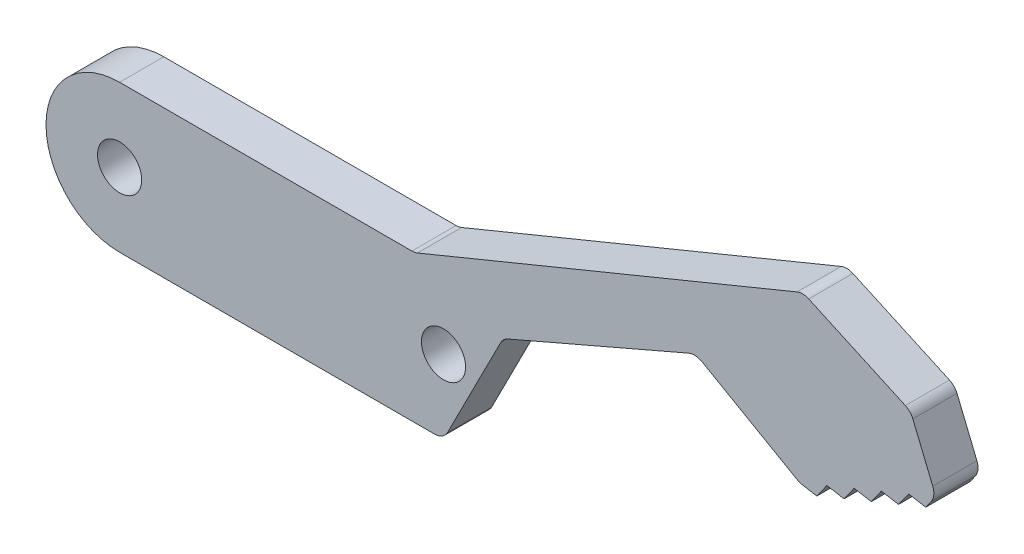
ISO-10303-21;
HEADER;
FILE_DESCRIPTION(('STEP AP214'),'2;1');
FILE_NAME('part.step','',(''),(''),'','','');
FILE_SCHEMA(('AUTOMOTIVE_DESIGN { 1 0 10303 214 1 1 1 1 }'));
ENDSEC;
DATA;
#1=APPLICATION_CONTEXT('core data for automotive mechanical design processes');
#2=APPLICATION_PROTOCOL_DEFINITION('international standard','automotive_design',2000,#1);
#3=PRODUCT_CONTEXT('',#1,'mechanical');
#4=PRODUCT('Part','Part','',(#3));
#5=PRODUCT_RELATED_PRODUCT_CATEGORY('part','',(#4));
#6=PRODUCT_DEFINITION_FORMATION('','',#4);
#7=PRODUCT_DEFINITION_CONTEXT('part definition',#1,'design');
#8=PRODUCT_DEFINITION('design','',#6,#7);
#9=PRODUCT_DEFINITION_SHAPE('','',#8);
#10=(LENGTH_UNIT() NAMED_UNIT(*) SI_UNIT(.MILLI.,.METRE.));
#11=(NAMED_UNIT(*) PLANE_ANGLE_UNIT() SI_UNIT($,.RADIAN.));
#12=(NAMED_UNIT(*) SI_UNIT($,.STERADIAN.) SOLID_ANGLE_UNIT());
#13=UNCERTAINTY_MEASURE_WITH_UNIT(LENGTH_MEASURE(1.E-05),#10,'distance_accuracy_value','');
#14=(GEOMETRIC_REPRESENTATION_CONTEXT(3) GLOBAL_UNCERTAINTY_ASSIGNED_CONTEXT((#13)) GLOBAL_UNIT_ASSIGNED_CONTEXT((#10,
#11,#12)) REPRESENTATION_CONTEXT('',''));
#15=CARTESIAN_POINT('',(0.,0.,0.));
#16=DIRECTION('',(0.,0.,1.));
#17=DIRECTION('',(1.,0.,0.));
#18=AXIS2_PLACEMENT_3D('',#15,#16,#17);
#19=CARTESIAN_POINT('',(19.4962894595564,-9.92044913865942,3.));
#20=DIRECTION('',(0.891254300812614,-0.453503882324086,0.));
#21=DIRECTION('',(0.453503882324086,0.891254300812614,0.));
#22=AXIS2_PLACEMENT_3D('',#19,#20,#21);
#23=PLANE('',#22);
#24=DIRECTION('',(-0.453503882324086,-0.891254300812614,0.));
#25=VECTOR('',#24,1.);
#26=CARTESIAN_POINT('',(19.4962894595564,-9.92044913865942,0.));
#27=LINE('',#26,#25);
#28=CARTESIAN_POINT('',(25.8783067701919,2.62189194740786,0.));
#29=VERTEX_POINT('',#28);
#30=CARTESIAN_POINT('',(22.278077885083,-4.45350388232409,0.));
#31=VERTEX_POINT('',#30);
#32=EDGE_CURVE('E326',#29,#31,#27,.T.);
#33=ORIENTED_EDGE('',*,*,#32,.F.);
#34=DIRECTION('',(0.,0.,-1.));
#35=VECTOR('',#34,1.);
#36=CARTESIAN_POINT('',(25.8783067701919,2.62189194740786,3.));
#37=LINE('',#36,#35);
#38=CARTESIAN_POINT('',(25.8783067701919,2.62189194740786,3.));
#39=VERTEX_POINT('',#38);
#40=EDGE_CURVE('E312',#29,#39,#37,.F.);
#41=ORIENTED_EDGE('',*,*,#40,.T.);
#42=DIRECTION('',(-0.453503882324086,-0.891254300812614,0.));
#43=VECTOR('',#42,1.);
#44=CARTESIAN_POINT('',(19.4962894595564,-9.92044913865942,3.));
#45=LINE('',#44,#43);
#46=CARTESIAN_POINT('',(22.278077885083,-4.45350388232409,3.));
#47=VERTEX_POINT('',#46);
#48=EDGE_CURVE('E344',#39,#47,#45,.T.);
#49=ORIENTED_EDGE('',*,*,#48,.T.);
#50=DIRECTION('',(0.,0.,-1.));
#51=VECTOR('',#50,1.);
#52=CARTESIAN_POINT('',(22.278077885083,-4.45350388232409,0.));
#53=LINE('',#52,#51);
#54=EDGE_CURVE('E309',#47,#31,#53,.T.);
#55=ORIENTED_EDGE('',*,*,#54,.T.);
#56=EDGE_LOOP('',(#33,#41,#49,#55));
#57=FACE_BOUND('',#56,.T.);
#58=ADVANCED_FACE('F45',(#57),#23,.T.);
#59=CARTESIAN_POINT('',(3.02444816193977,-7.00068530324171,3.));
#60=DIRECTION('',(0.396593498418017,-0.917994333867349,0.));
#61=DIRECTION('',(0.917994333867349,0.396593498418017,0.));
#62=AXIS2_PLACEMENT_3D('',#59,#60,#61);
#63=PLANE('',#62);
#64=DIRECTION('',(-0.917994333867349,-0.396593498418017,0.));
#65=VECTOR('',#64,1.);
#66=CARTESIAN_POINT('',(3.02444816193977,-7.00068530324171,0.));
#67=LINE('',#66,#65);
#68=CARTESIAN_POINT('',(38.6548047170005,8.39240290518155,0.));
#69=VERTEX_POINT('',#68);
#70=CARTESIAN_POINT('',(26.3729675725865,3.08638239895113,0.));
#71=VERTEX_POINT('',#70);
#72=EDGE_CURVE('E328',#69,#71,#67,.T.);
#73=ORIENTED_EDGE('',*,*,#72,.F.);
#74=DIRECTION('',(0.,0.,-1.));
#75=VECTOR('',#74,1.);
#76=CARTESIAN_POINT('',(38.6548047170005,8.39240290518155,3.));
#77=LINE('',#76,#75);
#78=CARTESIAN_POINT('',(38.6548047170005,8.39240290518155,3.));
#79=VERTEX_POINT('',#78);
#80=EDGE_CURVE('E307',#69,#79,#77,.F.);
#81=ORIENTED_EDGE('',*,*,#80,.T.);
#82=DIRECTION('',(-0.917994333867349,-0.396593498418017,0.));
#83=VECTOR('',#82,1.);
#84=CARTESIAN_POINT('',(3.02444816193977,-7.00068530324171,3.));
#85=LINE('',#84,#83);
#86=CARTESIAN_POINT('',(26.3729675725865,3.08638239895113,3.));
#87=VERTEX_POINT('',#86);
#88=EDGE_CURVE('E342',#79,#87,#85,.T.);
#89=ORIENTED_EDGE('',*,*,#88,.T.);
#90=DIRECTION('',(0.,0.,-1.));
#91=VECTOR('',#90,1.);
#92=CARTESIAN_POINT('',(26.3729675725865,3.08638239895112,0.));
#93=LINE('',#92,#91);
#94=EDGE_CURVE('E304',#87,#71,#93,.T.);
#95=ORIENTED_EDGE('',*,*,#94,.T.);
#96=EDGE_LOOP('',(#73,#81,#89,#95));
#97=FACE_BOUND('',#96,.T.);
#98=ADVANCED_FACE('F346',(#97),#63,.T.);
#99=CARTESIAN_POINT('',(13.3625167381365,23.3363393857757,3.));
#100=DIRECTION('',(-0.496908690756811,-0.867802830745759,0.));
#101=DIRECTION('',(0.867802830745759,-0.496908690756811,0.));
#102=AXIS2_PLACEMENT_3D('',#99,#100,#101);
#103=PLANE('',#102);
#104=DIRECTION('',(-0.867802830745759,0.496908690756811,0.));
#105=VECTOR('',#104,1.);
#106=CARTESIAN_POINT('',(13.3625167381365,23.3363393857757,0.));
#107=LINE('',#106,#105);
#108=CARTESIAN_POINT('',(46.0359803236668,4.6273337942362,0.));
#109=VERTEX_POINT('',#108);
#110=CARTESIAN_POINT('',(39.5483069061753,8.34221140205995,0.));
#111=VERTEX_POINT('',#110);
#112=EDGE_CURVE('E400',#109,#111,#107,.T.);
#113=ORIENTED_EDGE('',*,*,#112,.F.);
#114=DIRECTION('',(0.,0.,-1.));
#115=VECTOR('',#114,1.);
#116=CARTESIAN_POINT('',(46.0359803236668,4.6273337942362,3.));
#117=LINE('',#116,#115);
#118=CARTESIAN_POINT('',(46.0359803236668,4.6273337942362,3.));
#119=VERTEX_POINT('',#118);
#120=EDGE_CURVE('E273',#109,#119,#117,.F.);
#121=ORIENTED_EDGE('',*,*,#120,.T.);
#122=DIRECTION('',(-0.867802830745759,0.496908690756811,0.));
#123=VECTOR('',#122,1.);
#124=CARTESIAN_POINT('',(13.3625167381365,23.3363393857757,3.));
#125=LINE('',#124,#123);
#126=CARTESIAN_POINT('',(39.5483069061753,8.34221140205995,3.));
#127=VERTEX_POINT('',#126);
#128=EDGE_CURVE('E238',#119,#127,#125,.T.);
#129=ORIENTED_EDGE('',*,*,#128,.T.);
#130=DIRECTION('',(0.,0.,-1.));
#131=VECTOR('',#130,1.);
#132=CARTESIAN_POINT('',(39.5483069061753,8.34221140205995,0.));
#133=LINE('',#132,#131);
#134=EDGE_CURVE('E270',#127,#111,#133,.T.);
#135=ORIENTED_EDGE('',*,*,#134,.T.);
#136=EDGE_LOOP('',(#113,#121,#129,#135));
#137=FACE_BOUND('',#136,.T.);
#138=ADVANCED_FACE('F553',(#137),#103,.T.);
#139=CARTESIAN_POINT('',(2.12068725055269,12.200106201943,3.));
#140=DIRECTION('',(0.171257275030371,0.985226342395072,0.));
#141=DIRECTION('',(-0.985226342395072,0.171257275030371,0.));
#142=AXIS2_PLACEMENT_3D('',#139,#140,#141);
#143=PLANE('',#142);
#144=DIRECTION('',(0.985226342395072,-0.171257275030371,0.));
#145=VECTOR('',#144,1.);
#146=CARTESIAN_POINT('',(2.12068725055269,12.200106201943,3.));
#147=LINE('',#146,#145);
#148=CARTESIAN_POINT('',(46.3616317393933,4.50991028258688,3.));
#149=VERTEX_POINT('',#148);
#150=CARTESIAN_POINT('',(47.3529322035688,4.33759717145107,3.));
#151=VERTEX_POINT('',#150);
#152=EDGE_CURVE('E225',#149,#151,#147,.T.);
#153=ORIENTED_EDGE('',*,*,#152,.F.);
#154=DIRECTION('',(0.,0.,-1.));
#155=VECTOR('',#154,1.);
#156=CARTESIAN_POINT('',(46.3616317393933,4.50991028258688,0.));
#157=LINE('',#156,#155);
#158=CARTESIAN_POINT('',(46.3616317393933,4.50991028258688,0.));
#159=VERTEX_POINT('',#158);
#160=EDGE_CURVE('E253',#149,#159,#157,.T.);
#161=ORIENTED_EDGE('',*,*,#160,.T.);
#162=DIRECTION('',(0.985226342395072,-0.171257275030371,0.));
#163=VECTOR('',#162,1.);
#164=CARTESIAN_POINT('',(2.12068725055269,12.200106201943,0.));
#165=LINE('',#164,#163);
#166=CARTESIAN_POINT('',(47.3529322035688,4.33759717145107,0.));
#167=VERTEX_POINT('',#166);
#168=EDGE_CURVE('E251',#159,#167,#165,.T.);
#169=ORIENTED_EDGE('',*,*,#168,.T.);
#170=DIRECTION('',(0.,0.,-1.));
#171=VECTOR('',#170,1.);
#172=CARTESIAN_POINT('',(47.3529322035688,4.33759717145107,3.));
#173=LINE('',#172,#171);
#174=EDGE_CURVE('E244',#151,#167,#173,.T.);
#175=ORIENTED_EDGE('',*,*,#174,.F.);
#176=EDGE_LOOP('',(#153,#161,#169,#175));
#177=FACE_BOUND('',#176,.T.);
#178=ADVANCED_FACE('F249',(#177),#143,.F.);
#179=CARTESIAN_POINT('',(29.3832302084348,-20.911746854221,3.));
#180=DIRECTION('',(-0.814732571298571,0.579836905746106,0.));
#181=DIRECTION('',(-0.579836905746106,-0.814732571298571,0.));
#182=AXIS2_PLACEMENT_3D('',#179,#180,#181);
#183=PLANE('',#182);
#184=DIRECTION('',(0.579836905746106,0.814732571298571,0.));
#185=VECTOR('',#184,1.);
#186=CARTESIAN_POINT('',(29.3832302084348,-20.911746854221,0.));
#187=LINE('',#186,#185);
#188=CARTESIAN_POINT('',(48.0382444817135,5.30053386792921,0.));
#189=VERTEX_POINT('',#188);
#190=EDGE_CURVE('E404',#167,#189,#187,.T.);
#191=ORIENTED_EDGE('',*,*,#190,.T.);
#192=DIRECTION('',(0.,0.,-1.));
#193=VECTOR('',#192,1.);
#194=CARTESIAN_POINT('',(48.0382444817135,5.30053386792921,3.));
#195=LINE('',#194,#193);
#196=CARTESIAN_POINT('',(48.0382444817135,5.30053386792921,3.));
#197=VERTEX_POINT('',#196);
#198=EDGE_CURVE('E246',#197,#189,#195,.T.);
#199=ORIENTED_EDGE('',*,*,#198,.F.);
#200=DIRECTION('',(0.579836905746106,0.814732571298571,0.));
#201=VECTOR('',#200,1.);
#202=CARTESIAN_POINT('',(29.3832302084348,-20.911746854221,3.));
#203=LINE('',#202,#201);
#204=EDGE_CURVE('E230',#151,#197,#203,.T.);
#205=ORIENTED_EDGE('',*,*,#204,.F.);
#206=ORIENTED_EDGE('',*,*,#174,.T.);
#207=EDGE_LOOP('',(#191,#199,#205,#206));
#208=FACE_BOUND('',#207,.T.);
#209=ADVANCED_FACE('F243',(#208),#183,.F.);
#210=CARTESIAN_POINT('',(2.30326040358783,13.2504316830208,3.));
#211=DIRECTION('',(0.171257275030372,0.985226342395072,0.));
#212=DIRECTION('',(-0.985226342395072,0.171257275030372,0.));
#213=AXIS2_PLACEMENT_3D('',#210,#211,#212);
#214=PLANE('',#213);
#215=DIRECTION('',(0.985226342395072,-0.171257275030372,0.));
#216=VECTOR('',#215,1.);
#217=CARTESIAN_POINT('',(2.30326040358783,13.2504316830208,0.));
#218=LINE('',#217,#216);
#219=CARTESIAN_POINT('',(49.2026886599019,5.09812399691748,0.));
#220=VERTEX_POINT('',#219);
#221=EDGE_CURVE('E406',#189,#220,#218,.T.);
#222=ORIENTED_EDGE('',*,*,#221,.T.);
#223=DIRECTION('',(0.,0.,-1.));
#224=VECTOR('',#223,1.);
#225=CARTESIAN_POINT('',(49.2026886599019,5.09812399691748,3.));
#226=LINE('',#225,#224);
#227=CARTESIAN_POINT('',(49.2026886599019,5.09812399691748,3.));
#228=VERTEX_POINT('',#227);
#229=EDGE_CURVE('E257',#228,#220,#226,.T.);
#230=ORIENTED_EDGE('',*,*,#229,.F.);
#231=DIRECTION('',(0.985226342395072,-0.171257275030372,0.));
#232=VECTOR('',#231,1.);
#233=CARTESIAN_POINT('',(2.30326040358783,13.2504316830208,3.));
#234=LINE('',#233,#232);
#235=EDGE_CURVE('E247',#197,#228,#234,.T.);
#236=ORIENTED_EDGE('',*,*,#235,.F.);
#237=ORIENTED_EDGE('',*,*,#198,.T.);
#238=EDGE_LOOP('',(#222,#230,#236,#237));
#239=FACE_BOUND('',#238,.T.);
#240=ADVANCED_FACE('F475',(#239),#214,.F.);
#241=CARTESIAN_POINT('',(30.2517964891724,-21.5298966648462,3.));
#242=DIRECTION('',(-0.814732571298572,0.579836905746105,0.));
#243=DIRECTION('',(-0.579836905746105,-0.814732571298572,0.));
#244=AXIS2_PLACEMENT_3D('',#241,#242,#243);
#245=PLANE('',#244);
#246=DIRECTION('',(0.579836905746105,0.814732571298572,0.));
#247=VECTOR('',#246,1.);
#248=CARTESIAN_POINT('',(30.2517964891724,-21.5298966648462,0.));
#249=LINE('',#248,#247);
#250=CARTESIAN_POINT('',(49.8880009380466,6.06106069339563,0.));
#251=VERTEX_POINT('',#250);
#252=EDGE_CURVE('E409',#220,#251,#249,.T.);
#253=ORIENTED_EDGE('',*,*,#252,.T.);
#254=DIRECTION('',(0.,0.,-1.));
#255=VECTOR('',#254,1.);
#256=CARTESIAN_POINT('',(49.8880009380466,6.06106069339563,3.));
#257=LINE('',#256,#255);
#258=CARTESIAN_POINT('',(49.8880009380466,6.06106069339563,3.));
#259=VERTEX_POINT('',#258);
#260=EDGE_CURVE('E467',#259,#251,#257,.T.);
#261=ORIENTED_EDGE('',*,*,#260,.F.);
#262=DIRECTION('',(0.579836905746105,0.814732571298572,0.));
#263=VECTOR('',#262,1.);
#264=CARTESIAN_POINT('',(30.2517964891724,-21.5298966648462,3.));
#265=LINE('',#264,#263);
#266=EDGE_CURVE('E356',#228,#259,#265,.T.);
#267=ORIENTED_EDGE('',*,*,#266,.F.);
#268=ORIENTED_EDGE('',*,*,#229,.T.);
#269=EDGE_LOOP('',(#253,#261,#267,#268));
#270=FACE_BOUND('',#269,.T.);
#271=ADVANCED_FACE('F472',(#270),#245,.F.);
#272=CARTESIAN_POINT('',(2.485833556623,14.3007571640986,3.));
#273=DIRECTION('',(0.171257275030373,0.985226342395072,0.));
#274=DIRECTION('',(-0.985226342395072,0.171257275030373,0.));
#275=AXIS2_PLACEMENT_3D('',#272,#273,#274);
#276=PLANE('',#275);
#277=DIRECTION('',(0.985226342395072,-0.171257275030373,0.));
#278=VECTOR('',#277,1.);
#279=CARTESIAN_POINT('',(2.485833556623,14.3007571640986,0.));
#280=LINE('',#279,#278);
#281=CARTESIAN_POINT('',(51.052445116235,5.8586508223839,0.));
#282=VERTEX_POINT('',#281);
#283=EDGE_CURVE('E412',#251,#282,#280,.T.);
#284=ORIENTED_EDGE('',*,*,#283,.T.);
#285=DIRECTION('',(0.,0.,-1.));
#286=VECTOR('',#285,1.);
#287=CARTESIAN_POINT('',(51.052445116235,5.8586508223839,3.));
#288=LINE('',#287,#286);
#289=CARTESIAN_POINT('',(51.052445116235,5.8586508223839,3.));
#290=VERTEX_POINT('',#289);
#291=EDGE_CURVE('E464',#290,#282,#288,.T.);
#292=ORIENTED_EDGE('',*,*,#291,.F.);
#293=DIRECTION('',(0.985226342395072,-0.171257275030373,0.));
#294=VECTOR('',#293,1.);
#295=CARTESIAN_POINT('',(2.485833556623,14.3007571640986,3.));
#296=LINE('',#295,#294);
#297=EDGE_CURVE('E359',#259,#290,#296,.T.);
#298=ORIENTED_EDGE('',*,*,#297,.F.);
#299=ORIENTED_EDGE('',*,*,#260,.T.);
#300=EDGE_LOOP('',(#284,#292,#298,#299));
#301=FACE_BOUND('',#300,.T.);
#302=ADVANCED_FACE('F478',(#301),#276,.F.);
#303=CARTESIAN_POINT('',(31.1203627699101,-22.1480464754713,3.));
#304=DIRECTION('',(-0.814732571298571,0.579836905746106,0.));
#305=DIRECTION('',(-0.579836905746106,-0.814732571298571,0.));
#306=AXIS2_PLACEMENT_3D('',#303,#304,#305);
#307=PLANE('',#306);
#308=DIRECTION('',(0.579836905746106,0.814732571298571,0.));
#309=VECTOR('',#308,1.);
#310=CARTESIAN_POINT('',(31.1203627699101,-22.1480464754713,0.));
#311=LINE('',#310,#309);
#312=CARTESIAN_POINT('',(51.7377573943796,6.82158751886204,0.));
#313=VERTEX_POINT('',#312);
#314=EDGE_CURVE('E415',#282,#313,#311,.T.);
#315=ORIENTED_EDGE('',*,*,#314,.T.);
#316=DIRECTION('',(0.,0.,-1.));
#317=VECTOR('',#316,1.);
#318=CARTESIAN_POINT('',(51.7377573943796,6.82158751886204,3.));
#319=LINE('',#318,#317);
#320=CARTESIAN_POINT('',(51.7377573943796,6.82158751886204,3.));
#321=VERTEX_POINT('',#320);
#322=EDGE_CURVE('E461',#321,#313,#319,.T.);
#323=ORIENTED_EDGE('',*,*,#322,.F.);
#324=DIRECTION('',(0.579836905746106,0.814732571298571,0.));
#325=VECTOR('',#324,1.);
#326=CARTESIAN_POINT('',(31.1203627699101,-22.1480464754713,3.));
#327=LINE('',#326,#325);
#328=EDGE_CURVE('E362',#290,#321,#327,.T.);
#329=ORIENTED_EDGE('',*,*,#328,.F.);
#330=ORIENTED_EDGE('',*,*,#291,.T.);
#331=EDGE_LOOP('',(#315,#323,#329,#330));
#332=FACE_BOUND('',#331,.T.);
#333=ADVANCED_FACE('F482',(#332),#307,.F.);
#334=CARTESIAN_POINT('',(2.668406709658,15.351082645176,3.));
#335=DIRECTION('',(0.171257275030368,0.985226342395073,0.));
#336=DIRECTION('',(-0.985226342395073,0.171257275030368,0.));
#337=AXIS2_PLACEMENT_3D('',#334,#335,#336);
#338=PLANE('',#337);
#339=DIRECTION('',(0.985226342395073,-0.171257275030368,0.));
#340=VECTOR('',#339,1.);
#341=CARTESIAN_POINT('',(2.668406709658,15.351082645176,0.));
#342=LINE('',#341,#340);
#343=CARTESIAN_POINT('',(52.9022015725681,6.61917764785031,0.));
#344=VERTEX_POINT('',#343);
#345=EDGE_CURVE('E418',#313,#344,#342,.T.);
#346=ORIENTED_EDGE('',*,*,#345,.T.);
#347=DIRECTION('',(0.,0.,-1.));
#348=VECTOR('',#347,1.);
#349=CARTESIAN_POINT('',(52.9022015725681,6.61917764785031,3.));
#350=LINE('',#349,#348);
#351=CARTESIAN_POINT('',(52.9022015725681,6.61917764785031,3.));
#352=VERTEX_POINT('',#351);
#353=EDGE_CURVE('E458',#352,#344,#350,.T.);
#354=ORIENTED_EDGE('',*,*,#353,.F.);
#355=DIRECTION('',(0.985226342395073,-0.171257275030368,0.));
#356=VECTOR('',#355,1.);
#357=CARTESIAN_POINT('',(2.668406709658,15.351082645176,3.));
#358=LINE('',#357,#356);
#359=EDGE_CURVE('E365',#321,#352,#358,.T.);
#360=ORIENTED_EDGE('',*,*,#359,.F.);
#361=ORIENTED_EDGE('',*,*,#322,.T.);
#362=EDGE_LOOP('',(#346,#354,#360,#361));
#363=FACE_BOUND('',#362,.T.);
#364=ADVANCED_FACE('F484',(#363),#338,.F.);
#365=CARTESIAN_POINT('',(31.9889290506477,-22.7661962860964,3.));
#366=DIRECTION('',(-0.814732571298571,0.579836905746106,0.));
#367=DIRECTION('',(-0.579836905746106,-0.814732571298571,0.));
#368=AXIS2_PLACEMENT_3D('',#365,#366,#367);
#369=PLANE('',#368);
#370=DIRECTION('',(0.579836905746106,0.814732571298571,0.));
#371=VECTOR('',#370,1.);
#372=CARTESIAN_POINT('',(31.9889290506477,-22.7661962860964,0.));
#373=LINE('',#372,#371);
#374=CARTESIAN_POINT('',(53.5875138507128,7.58211434432845,0.));
#375=VERTEX_POINT('',#374);
#376=EDGE_CURVE('E421',#344,#375,#373,.T.);
#377=ORIENTED_EDGE('',*,*,#376,.T.);
#378=DIRECTION('',(0.,0.,-1.));
#379=VECTOR('',#378,1.);
#380=CARTESIAN_POINT('',(53.5875138507128,7.58211434432845,3.));
#381=LINE('',#380,#379);
#382=CARTESIAN_POINT('',(53.5875138507128,7.58211434432845,3.));
#383=VERTEX_POINT('',#382);
#384=EDGE_CURVE('E455',#383,#375,#381,.T.);
#385=ORIENTED_EDGE('',*,*,#384,.F.);
#386=DIRECTION('',(0.579836905746106,0.814732571298571,0.));
#387=VECTOR('',#386,1.);
#388=CARTESIAN_POINT('',(31.9889290506477,-22.7661962860964,3.));
#389=LINE('',#388,#387);
#390=EDGE_CURVE('E368',#352,#383,#389,.T.);
#391=ORIENTED_EDGE('',*,*,#390,.F.);
#392=ORIENTED_EDGE('',*,*,#353,.T.);
#393=EDGE_LOOP('',(#377,#385,#391,#392));
#394=FACE_BOUND('',#393,.T.);
#395=ADVANCED_FACE('F486',(#394),#369,.F.);
#396=CARTESIAN_POINT('',(2.85097986269318,16.4014081262539,3.));
#397=DIRECTION('',(0.17125727503037,0.985226342395072,0.));
#398=DIRECTION('',(-0.985226342395072,0.17125727503037,0.));
#399=AXIS2_PLACEMENT_3D('',#396,#397,#398);
#400=PLANE('',#399);
#401=DIRECTION('',(0.985226342395072,-0.17125727503037,0.));
#402=VECTOR('',#401,1.);
#403=CARTESIAN_POINT('',(2.85097986269318,16.4014081262539,0.));
#404=LINE('',#403,#402);
#405=CARTESIAN_POINT('',(54.7519580289012,7.37970447331673,0.));
#406=VERTEX_POINT('',#405);
#407=EDGE_CURVE('E424',#375,#406,#404,.T.);
#408=ORIENTED_EDGE('',*,*,#407,.T.);
#409=DIRECTION('',(0.,0.,-1.));
#410=VECTOR('',#409,1.);
#411=CARTESIAN_POINT('',(54.7519580289012,7.37970447331673,3.));
#412=LINE('',#411,#410);
#413=CARTESIAN_POINT('',(54.7519580289012,7.37970447331673,3.));
#414=VERTEX_POINT('',#413);
#415=EDGE_CURVE('E452',#414,#406,#412,.T.);
#416=ORIENTED_EDGE('',*,*,#415,.F.);
#417=DIRECTION('',(0.985226342395072,-0.17125727503037,0.));
#418=VECTOR('',#417,1.);
#419=CARTESIAN_POINT('',(2.85097986269318,16.4014081262539,3.));
#420=LINE('',#419,#418);
#421=EDGE_CURVE('E371',#383,#414,#420,.T.);
#422=ORIENTED_EDGE('',*,*,#421,.F.);
#423=ORIENTED_EDGE('',*,*,#384,.T.);
#424=EDGE_LOOP('',(#408,#416,#422,#423));
#425=FACE_BOUND('',#424,.T.);
#426=ADVANCED_FACE('F491',(#425),#400,.F.);
#427=CARTESIAN_POINT('',(32.8574953313853,-23.3843460967216,3.));
#428=DIRECTION('',(-0.81473257129857,0.579836905746108,0.));
#429=DIRECTION('',(-0.579836905746108,-0.81473257129857,0.));
#430=AXIS2_PLACEMENT_3D('',#427,#428,#429);
#431=PLANE('',#430);
#432=DIRECTION('',(0.579836905746108,0.81473257129857,0.));
#433=VECTOR('',#432,1.);
#434=CARTESIAN_POINT('',(32.8574953313853,-23.3843460967216,0.));
#435=LINE('',#434,#433);
#436=CARTESIAN_POINT('',(55.1172552795213,7.89298599323483,0.));
#437=VERTEX_POINT('',#436);
#438=EDGE_CURVE('E427',#406,#437,#435,.T.);
#439=ORIENTED_EDGE('',*,*,#438,.T.);
#440=DIRECTION('',(0.,0.,-1.));
#441=VECTOR('',#440,1.);
#442=CARTESIAN_POINT('',(55.1172552795213,7.89298599323483,3.));
#443=LINE('',#442,#441);
#444=CARTESIAN_POINT('',(55.1172552795213,7.89298599323483,3.));
#445=VERTEX_POINT('',#444);
#446=EDGE_CURVE('E289',#437,#445,#443,.F.);
#447=ORIENTED_EDGE('',*,*,#446,.T.);
#448=DIRECTION('',(0.579836905746108,0.81473257129857,0.));
#449=VECTOR('',#448,1.);
#450=CARTESIAN_POINT('',(32.8574953313853,-23.3843460967216,3.));
#451=LINE('',#450,#449);
#452=EDGE_CURVE('E374',#414,#445,#451,.T.);
#453=ORIENTED_EDGE('',*,*,#452,.F.);
#454=ORIENTED_EDGE('',*,*,#415,.T.);
#455=EDGE_LOOP('',(#439,#447,#453,#454));
#456=FACE_BOUND('',#455,.T.);
#457=ADVANCED_FACE('F493',(#456),#431,.F.);
#458=CARTESIAN_POINT('',(50.3551112402657,20.7034892439219,3.));
#459=DIRECTION('',(0.924878228166549,0.380263412733207,0.));
#460=DIRECTION('',(-0.380263412733207,0.924878228166549,0.));
#461=AXIS2_PLACEMENT_3D('',#458,#459,#460);
#462=PLANE('',#461);
#463=DIRECTION('',(0.380263412733207,-0.924878228166549,0.));
#464=VECTOR('',#463,1.);
#465=CARTESIAN_POINT('',(50.3551112402657,20.7034892439219,3.));
#466=LINE('',#465,#464);
#467=CARTESIAN_POINT('',(53.8764912996726,12.138774256918,3.));
#468=VERTEX_POINT('',#467);
#469=CARTESIAN_POINT('',(55.2274009363893,8.85308631171415,3.));
#470=VERTEX_POINT('',#469);
#471=EDGE_CURVE('E377',#468,#470,#466,.T.);
#472=ORIENTED_EDGE('',*,*,#471,.T.);
#473=DIRECTION('',(0.,0.,-1.));
#474=VECTOR('',#473,1.);
#475=CARTESIAN_POINT('',(55.2274009363893,8.85308631171414,0.));
#476=LINE('',#475,#474);
#477=CARTESIAN_POINT('',(55.2274009363893,8.85308631171415,0.));
#478=VERTEX_POINT('',#477);
#479=EDGE_CURVE('E286',#470,#478,#476,.T.);
#480=ORIENTED_EDGE('',*,*,#479,.T.);
#481=DIRECTION('',(0.380263412733207,-0.924878228166549,0.));
#482=VECTOR('',#481,1.);
#483=CARTESIAN_POINT('',(50.3551112402657,20.7034892439219,0.));
#484=LINE('',#483,#482);
#485=CARTESIAN_POINT('',(53.8764912996726,12.138774256918,0.));
#486=VERTEX_POINT('',#485);
#487=EDGE_CURVE('E430',#486,#478,#484,.T.);
#488=ORIENTED_EDGE('',*,*,#487,.F.);
#489=DIRECTION('',(0.,0.,-1.));
#490=VECTOR('',#489,1.);
#491=CARTESIAN_POINT('',(53.8764912996726,12.138774256918,3.));
#492=LINE('',#491,#490);
#493=EDGE_CURVE('E284',#486,#468,#492,.F.);
#494=ORIENTED_EDGE('',*,*,#493,.T.);
#495=EDGE_LOOP('',(#472,#480,#488,#494));
#496=FACE_BOUND('',#495,.T.);
#497=ADVANCED_FACE('F501',(#496),#462,.T.);
#498=CARTESIAN_POINT('',(13.9488099268583,30.6231164748254,3.));
#499=DIRECTION('',(0.414522259932086,0.910039172794664,0.));
#500=DIRECTION('',(-0.910039172794664,0.414522259932086,0.));
#501=AXIS2_PLACEMENT_3D('',#498,#499,#500);
#502=PLANE('',#501);
#503=DIRECTION('',(0.910039172794664,-0.414522259932086,0.));
#504=VECTOR('',#503,1.);
#505=CARTESIAN_POINT('',(13.9488099268583,30.6231164748254,3.));
#506=LINE('',#505,#504);
#507=CARTESIAN_POINT('',(46.8032086062434,15.6579589338968,3.));
#508=VERTEX_POINT('',#507);
#509=CARTESIAN_POINT('',(53.3661353314382,12.6685500169795,3.));
#510=VERTEX_POINT('',#509);
#511=EDGE_CURVE('E380',#508,#510,#506,.T.);
#512=ORIENTED_EDGE('',*,*,#511,.T.);
#513=DIRECTION('',(0.,0.,-1.));
#514=VECTOR('',#513,1.);
#515=CARTESIAN_POINT('',(53.3661353314382,12.6685500169795,3.));
#516=LINE('',#515,#514);
#517=CARTESIAN_POINT('',(53.3661353314382,12.6685500169795,0.));
#518=VERTEX_POINT('',#517);
#519=EDGE_CURVE('E293',#510,#518,#516,.T.);
#520=ORIENTED_EDGE('',*,*,#519,.T.);
#521=DIRECTION('',(0.910039172794664,-0.414522259932086,0.));
#522=VECTOR('',#521,1.);
#523=CARTESIAN_POINT('',(13.9488099268583,30.6231164748254,0.));
#524=LINE('',#523,#522);
#525=CARTESIAN_POINT('',(46.8032086062434,15.6579589338968,0.));
#526=VERTEX_POINT('',#525);
#527=EDGE_CURVE('E433',#526,#518,#524,.T.);
#528=ORIENTED_EDGE('',*,*,#527,.F.);
#529=DIRECTION('',(0.,0.,-1.));
#530=VECTOR('',#529,1.);
#531=CARTESIAN_POINT('',(46.8032086062433,15.6579589338968,3.));
#532=LINE('',#531,#530);
#533=EDGE_CURVE('E291',#526,#508,#532,.F.);
#534=ORIENTED_EDGE('',*,*,#533,.T.);
#535=EDGE_LOOP('',(#512,#520,#528,#534));
#536=FACE_BOUND('',#535,.T.);
#537=ADVANCED_FACE('F510',(#536),#502,.T.);
#538=CARTESIAN_POINT('',(1.14074851739701,-2.77453321099285,3.));
#539=DIRECTION('',(-0.380263412733207,0.924878228166549,0.));
#540=DIRECTION('',(-0.924878228166549,-0.380263412733207,0.));
#541=AXIS2_PLACEMENT_3D('',#538,#539,#540);
#542=PLANE('',#541);
#543=DIRECTION('',(0.924878228166549,0.380263412733207,0.));
#544=VECTOR('',#543,1.);
#545=CARTESIAN_POINT('',(1.14074851739701,-2.77453321099285,3.));
#546=LINE('',#545,#544);
#547=CARTESIAN_POINT('',(20.2327114807882,5.07512177183346,3.));
#548=VERTEX_POINT('',#547);
#549=CARTESIAN_POINT('',(46.0084229335781,15.6727979892687,3.));
#550=VERTEX_POINT('',#549);
#551=EDGE_CURVE('E383',#548,#550,#546,.T.);
#552=ORIENTED_EDGE('',*,*,#551,.T.);
#553=DIRECTION('',(0.,0.,-1.));
#554=VECTOR('',#553,1.);
#555=CARTESIAN_POINT('',(46.0084229335781,15.6727979892687,3.));
#556=LINE('',#555,#554);
#557=CARTESIAN_POINT('',(46.0084229335781,15.6727979892687,0.));
#558=VERTEX_POINT('',#557);
#559=EDGE_CURVE('E298',#550,#558,#556,.T.);
#560=ORIENTED_EDGE('',*,*,#559,.T.);
#561=DIRECTION('',(0.924878228166549,0.380263412733207,0.));
#562=VECTOR('',#561,1.);
#563=CARTESIAN_POINT('',(1.14074851739701,-2.77453321099285,0.));
#564=LINE('',#563,#562);
#565=CARTESIAN_POINT('',(20.2327114807882,5.07512177183346,0.));
#566=VERTEX_POINT('',#565);
#567=EDGE_CURVE('E436',#566,#558,#564,.T.);
#568=ORIENTED_EDGE('',*,*,#567,.F.);
#569=DIRECTION('',(0.,0.,-1.));
#570=VECTOR('',#569,1.);
#571=CARTESIAN_POINT('',(20.2327114807882,5.07512177183345,3.));
#572=LINE('',#571,#570);
#573=EDGE_CURVE('E296',#566,#548,#572,.F.);
#574=ORIENTED_EDGE('',*,*,#573,.T.);
#575=EDGE_LOOP('',(#552,#560,#568,#574));
#576=FACE_BOUND('',#575,.T.);
#577=ADVANCED_FACE('F517',(#576),#542,.T.);
#578=CARTESIAN_POINT('',(0.,5.,3.));
#579=DIRECTION('',(0.,1.,0.));
#580=DIRECTION('',(-1.,0.,0.));
#581=AXIS2_PLACEMENT_3D('',#578,#579,#580);
#582=PLANE('',#581);
#583=DIRECTION('',(1.,0.,0.));
#584=VECTOR('',#583,1.);
#585=CARTESIAN_POINT('',(0.,5.,3.));
#586=LINE('',#585,#584);
#587=CARTESIAN_POINT('',(0.,5.,3.));
#588=VERTEX_POINT('',#587);
#589=CARTESIAN_POINT('',(19.852448068055,5.,3.));
#590=VERTEX_POINT('',#589);
#591=EDGE_CURVE('E386',#588,#590,#586,.T.);
#592=ORIENTED_EDGE('',*,*,#591,.T.);
#593=DIRECTION('',(0.,0.,-1.));
#594=VECTOR('',#593,1.);
#595=CARTESIAN_POINT('',(19.852448068055,5.,0.));
#596=LINE('',#595,#594);
#597=CARTESIAN_POINT('',(19.852448068055,5.,0.));
#598=VERTEX_POINT('',#597);
#599=EDGE_CURVE('E301',#590,#598,#596,.T.);
#600=ORIENTED_EDGE('',*,*,#599,.T.);
#601=DIRECTION('',(1.,0.,0.));
#602=VECTOR('',#601,1.);
#603=CARTESIAN_POINT('',(0.,5.,0.));
#604=LINE('',#603,#602);
#605=CARTESIAN_POINT('',(0.,5.,0.));
#606=VERTEX_POINT('',#605);
#607=EDGE_CURVE('E439',#606,#598,#604,.T.);
#608=ORIENTED_EDGE('',*,*,#607,.F.);
#609=DIRECTION('',(0.,0.,-1.));
#610=VECTOR('',#609,1.);
#611=CARTESIAN_POINT('',(0.,5.,3.));
#612=LINE('',#611,#610);
#613=EDGE_CURVE('E450',#588,#606,#612,.T.);
#614=ORIENTED_EDGE('',*,*,#613,.F.);
#615=EDGE_LOOP('',(#592,#600,#608,#614));
#616=FACE_BOUND('',#615,.T.);
#617=ADVANCED_FACE('F525',(#616),#582,.T.);
#618=CARTESIAN_POINT('',(0.,0.,3.));
#619=DIRECTION('',(0.,0.,-1.));
#620=DIRECTION('',(-1.,0.,0.));
#621=AXIS2_PLACEMENT_3D('',#618,#619,#620);
#622=CYLINDRICAL_SURFACE('',#621,5.);
#623=CARTESIAN_POINT('',(0.,0.,0.));
#624=DIRECTION('',(0.,0.,1.));
#625=DIRECTION('',(1.,0.,0.));
#626=AXIS2_PLACEMENT_3D('',#623,#624,#625);
#627=CIRCLE('',#626,5.);
#628=CARTESIAN_POINT('',(0.,-5.,0.));
#629=VERTEX_POINT('',#628);
#630=EDGE_CURVE('E442',#606,#629,#627,.T.);
#631=ORIENTED_EDGE('',*,*,#630,.T.);
#632=DIRECTION('',(0.,0.,-1.));
#633=VECTOR('',#632,1.);
#634=CARTESIAN_POINT('',(0.,-5.,3.));
#635=LINE('',#634,#633);
#636=CARTESIAN_POINT('',(0.,-5.,3.));
#637=VERTEX_POINT('',#636);
#638=EDGE_CURVE('E393',#637,#629,#635,.T.);
#639=ORIENTED_EDGE('',*,*,#638,.F.);
#640=CARTESIAN_POINT('',(0.,0.,3.));
#641=DIRECTION('',(0.,0.,1.));
#642=DIRECTION('',(1.,0.,0.));
#643=AXIS2_PLACEMENT_3D('',#640,#641,#642);
#644=CIRCLE('',#643,5.);
#645=EDGE_CURVE('E388',#588,#637,#644,.T.);
#646=ORIENTED_EDGE('',*,*,#645,.F.);
#647=ORIENTED_EDGE('',*,*,#613,.T.);
#648=EDGE_LOOP('',(#631,#639,#646,#647));
#649=FACE_BOUND('',#648,.T.);
#650=ADVANCED_FACE('F529',(#649),#622,.T.);
#651=CARTESIAN_POINT('',(22.,0.,3.));
#652=DIRECTION('',(0.,0.,-1.));
#653=DIRECTION('',(-1.,0.,0.));
#654=AXIS2_PLACEMENT_3D('',#651,#652,#653);
#655=CYLINDRICAL_SURFACE('',#654,1.5);
#656=CARTESIAN_POINT('',(22.,0.,3.));
#657=DIRECTION('',(0.,0.,1.));
#658=DIRECTION('',(1.,0.,0.));
#659=AXIS2_PLACEMENT_3D('',#656,#657,#658);
#660=CIRCLE('',#659,1.5);
#661=CARTESIAN_POINT('',(23.5,0.,3.));
#662=VERTEX_POINT('',#661);
#663=EDGE_CURVE('E351',#662,#662,#660,.T.);
#664=ORIENTED_EDGE('',*,*,#663,.T.);
#665=EDGE_LOOP('',(#664));
#666=FACE_BOUND('',#665,.T.);
#667=CARTESIAN_POINT('',(22.,0.,0.));
#668=DIRECTION('',(0.,0.,1.));
#669=DIRECTION('',(1.,0.,0.));
#670=AXIS2_PLACEMENT_3D('',#667,#668,#669);
#671=CIRCLE('',#670,1.5);
#672=CARTESIAN_POINT('',(23.5,0.,0.));
#673=VERTEX_POINT('',#672);
#674=EDGE_CURVE('E336',#673,#673,#671,.T.);
#675=ORIENTED_EDGE('',*,*,#674,.F.);
#676=EDGE_LOOP('',(#675));
#677=FACE_BOUND('',#676,.T.);
#678=ADVANCED_FACE('F543',(#666,#677),#655,.F.);
#679=CARTESIAN_POINT('',(0.,0.,3.));
#680=DIRECTION('',(0.,0.,-1.));
#681=DIRECTION('',(-1.,0.,0.));
#682=AXIS2_PLACEMENT_3D('',#679,#680,#681);
#683=CYLINDRICAL_SURFACE('',#682,1.5);
#684=CARTESIAN_POINT('',(0.,0.,3.));
#685=DIRECTION('',(0.,0.,1.));
#686=DIRECTION('',(1.,0.,0.));
#687=AXIS2_PLACEMENT_3D('',#684,#685,#686);
#688=CIRCLE('',#687,1.5);
#689=CARTESIAN_POINT('',(1.5,0.,3.));
#690=VERTEX_POINT('',#689);
#691=EDGE_CURVE('E447',#690,#690,#688,.T.);
#692=ORIENTED_EDGE('',*,*,#691,.T.);
#693=EDGE_LOOP('',(#692));
#694=FACE_BOUND('',#693,.T.);
#695=CARTESIAN_POINT('',(0.,0.,0.));
#696=DIRECTION('',(0.,0.,1.));
#697=DIRECTION('',(1.,0.,0.));
#698=AXIS2_PLACEMENT_3D('',#695,#696,#697);
#699=CIRCLE('',#698,1.5);
#700=CARTESIAN_POINT('',(1.5,0.,0.));
#701=VERTEX_POINT('',#700);
#702=EDGE_CURVE('E394',#701,#701,#699,.T.);
#703=ORIENTED_EDGE('',*,*,#702,.F.);
#704=EDGE_LOOP('',(#703));
#705=FACE_BOUND('',#704,.T.);
#706=ADVANCED_FACE('F535',(#694,#705),#683,.F.);
#707=CARTESIAN_POINT('',(0.,-5.,3.));
#708=DIRECTION('',(0.,1.,0.));
#709=DIRECTION('',(0.,0.,1.));
#710=AXIS2_PLACEMENT_3D('',#707,#708,#709);
#711=PLANE('',#710);
#712=DIRECTION('',(1.,0.,0.));
#713=VECTOR('',#712,1.);
#714=CARTESIAN_POINT('',(0.,-5.,0.));
#715=LINE('',#714,#713);
#716=CARTESIAN_POINT('',(21.3868235842704,-5.,0.));
#717=VERTEX_POINT('',#716);
#718=EDGE_CURVE('E445',#629,#717,#715,.T.);
#719=ORIENTED_EDGE('',*,*,#718,.T.);
#720=DIRECTION('',(0.,0.,-1.));
#721=VECTOR('',#720,1.);
#722=CARTESIAN_POINT('',(21.3868235842704,-5.,3.));
#723=LINE('',#722,#721);
#724=CARTESIAN_POINT('',(21.3868235842704,-5.,3.));
#725=VERTEX_POINT('',#724);
#726=EDGE_CURVE('E60',#717,#725,#723,.F.);
#727=ORIENTED_EDGE('',*,*,#726,.T.);
#728=DIRECTION('',(1.,0.,0.));
#729=VECTOR('',#728,1.);
#730=CARTESIAN_POINT('',(0.,-5.,3.));
#731=LINE('',#730,#729);
#732=EDGE_CURVE('E391',#637,#725,#731,.T.);
#733=ORIENTED_EDGE('',*,*,#732,.F.);
#734=ORIENTED_EDGE('',*,*,#638,.T.);
#735=EDGE_LOOP('',(#719,#727,#733,#734));
#736=FACE_BOUND('',#735,.T.);
#737=ADVANCED_FACE('F533',(#736),#711,.F.);
#738=CARTESIAN_POINT('',(0.,0.,3.));
#739=DIRECTION('',(0.,0.,1.));
#740=DIRECTION('',(1.,0.,0.));
#741=AXIS2_PLACEMENT_3D('',#738,#739,#740);
#742=PLANE('',#741);
#743=ORIENTED_EDGE('',*,*,#691,.F.);
#744=EDGE_LOOP('',(#743));
#745=FACE_BOUND('',#744,.T.);
#746=ORIENTED_EDGE('',*,*,#663,.F.);
#747=EDGE_LOOP('',(#746));
#748=FACE_BOUND('',#747,.T.);
#749=ORIENTED_EDGE('',*,*,#128,.F.);
#750=CARTESIAN_POINT('',(46.5328890144237,5.49513662498195,3.));
#751=DIRECTION('',(0.,0.,1.));
#752=DIRECTION('',(1.,0.,0.));
#753=AXIS2_PLACEMENT_3D('',#750,#751,#752);
#754=CIRCLE('',#753,1.);
#755=EDGE_CURVE('E233',#119,#149,#754,.T.);
#756=ORIENTED_EDGE('',*,*,#755,.T.);
#757=ORIENTED_EDGE('',*,*,#152,.T.);
#758=ORIENTED_EDGE('',*,*,#204,.T.);
#759=ORIENTED_EDGE('',*,*,#235,.T.);
#760=ORIENTED_EDGE('',*,*,#266,.T.);
#761=ORIENTED_EDGE('',*,*,#297,.T.);
#762=ORIENTED_EDGE('',*,*,#328,.T.);
#763=ORIENTED_EDGE('',*,*,#359,.T.);
#764=ORIENTED_EDGE('',*,*,#390,.T.);
#765=ORIENTED_EDGE('',*,*,#421,.T.);
#766=ORIENTED_EDGE('',*,*,#452,.T.);
#767=CARTESIAN_POINT('',(54.3025227082227,8.47282289898094,3.));
#768=DIRECTION('',(0.,0.,1.));
#769=DIRECTION('',(1.,0.,0.));
#770=AXIS2_PLACEMENT_3D('',#767,#768,#769);
#771=CIRCLE('',#770,1.);
#772=EDGE_CURVE('E281',#445,#470,#771,.T.);
#773=ORIENTED_EDGE('',*,*,#772,.T.);
#774=ORIENTED_EDGE('',*,*,#471,.F.);
#775=CARTESIAN_POINT('',(52.9516130715061,11.7585108441848,3.));
#776=DIRECTION('',(0.,0.,1.));
#777=DIRECTION('',(1.,0.,0.));
#778=AXIS2_PLACEMENT_3D('',#775,#776,#777);
#779=CIRCLE('',#778,1.);
#780=EDGE_CURVE('E279',#468,#510,#779,.T.);
#781=ORIENTED_EDGE('',*,*,#780,.T.);
#782=ORIENTED_EDGE('',*,*,#511,.F.);
#783=CARTESIAN_POINT('',(46.3886863463113,14.7479197611021,3.));
#784=DIRECTION('',(0.,0.,1.));
#785=DIRECTION('',(1.,0.,0.));
#786=AXIS2_PLACEMENT_3D('',#783,#784,#785);
#787=CIRCLE('',#786,1.);
#788=EDGE_CURVE('E277',#508,#550,#787,.T.);
#789=ORIENTED_EDGE('',*,*,#788,.T.);
#790=ORIENTED_EDGE('',*,*,#551,.F.);
#791=CARTESIAN_POINT('',(19.852448068055,6.,3.));
#792=DIRECTION('',(0.,0.,1.));
#793=DIRECTION('',(1.,0.,0.));
#794=AXIS2_PLACEMENT_3D('',#791,#792,#793);
#795=CIRCLE('',#794,1.);
#796=EDGE_CURVE('E68',#548,#590,#795,.F.);
#797=ORIENTED_EDGE('',*,*,#796,.T.);
#798=ORIENTED_EDGE('',*,*,#591,.F.);
#799=ORIENTED_EDGE('',*,*,#645,.T.);
#800=ORIENTED_EDGE('',*,*,#732,.T.);
#801=CARTESIAN_POINT('',(21.3868235842704,-4.,3.));
#802=DIRECTION('',(0.,0.,1.));
#803=DIRECTION('',(1.,0.,0.));
#804=AXIS2_PLACEMENT_3D('',#801,#802,#803);
#805=CIRCLE('',#804,1.);
#806=EDGE_CURVE('E275',#725,#47,#805,.T.);
#807=ORIENTED_EDGE('',*,*,#806,.T.);
#808=ORIENTED_EDGE('',*,*,#48,.F.);
#809=CARTESIAN_POINT('',(26.7695610710045,2.16838806508377,3.));
#810=DIRECTION('',(0.,0.,1.));
#811=DIRECTION('',(1.,0.,0.));
#812=AXIS2_PLACEMENT_3D('',#809,#810,#811);
#813=CIRCLE('',#812,1.);
#814=EDGE_CURVE('E11',#39,#87,#813,.F.);
#815=ORIENTED_EDGE('',*,*,#814,.T.);
#816=ORIENTED_EDGE('',*,*,#88,.F.);
#817=CARTESIAN_POINT('',(39.0513982154185,7.47440857131419,3.));
#818=DIRECTION('',(0.,0.,1.));
#819=DIRECTION('',(1.,0.,0.));
#820=AXIS2_PLACEMENT_3D('',#817,#818,#819);
#821=CIRCLE('',#820,1.);
#822=EDGE_CURVE('E320',#79,#127,#821,.F.);
#823=ORIENTED_EDGE('',*,*,#822,.T.);
#824=EDGE_LOOP('',(#749,#756,#757,#758,#759,#760,#761,#762,#763,#764,#765,#766,#773,#774,#781,
#782,#789,#790,#797,#798,#799,#800,#807,#808,#815,#816,#823));
#825=FACE_BOUND('',#824,.T.);
#826=ADVANCED_FACE('F228',(#745,#748,#825),#742,.T.);
#827=CARTESIAN_POINT('',(0.,0.,0.));
#828=DIRECTION('',(0.,0.,1.));
#829=DIRECTION('',(1.,0.,0.));
#830=AXIS2_PLACEMENT_3D('',#827,#828,#829);
#831=PLANE('',#830);
#832=ORIENTED_EDGE('',*,*,#702,.T.);
#833=EDGE_LOOP('',(#832));
#834=FACE_BOUND('',#833,.T.);
#835=ORIENTED_EDGE('',*,*,#674,.T.);
#836=EDGE_LOOP('',(#835));
#837=FACE_BOUND('',#836,.T.);
#838=ORIENTED_EDGE('',*,*,#168,.F.);
#839=CARTESIAN_POINT('',(46.5328890144237,5.49513662498195,0.));
#840=DIRECTION('',(0.,0.,1.));
#841=DIRECTION('',(1.,0.,0.));
#842=AXIS2_PLACEMENT_3D('',#839,#840,#841);
#843=CIRCLE('',#842,1.);
#844=EDGE_CURVE('E268',#159,#109,#843,.F.);
#845=ORIENTED_EDGE('',*,*,#844,.T.);
#846=ORIENTED_EDGE('',*,*,#112,.T.);
#847=CARTESIAN_POINT('',(39.0513982154185,7.47440857131419,0.));
#848=DIRECTION('',(0.,0.,1.));
#849=DIRECTION('',(1.,0.,0.));
#850=AXIS2_PLACEMENT_3D('',#847,#848,#849);
#851=CIRCLE('',#850,1.);
#852=EDGE_CURVE('E318',#111,#69,#851,.T.);
#853=ORIENTED_EDGE('',*,*,#852,.T.);
#854=ORIENTED_EDGE('',*,*,#72,.T.);
#855=CARTESIAN_POINT('',(26.7695610710045,2.16838806508377,0.));
#856=DIRECTION('',(0.,0.,1.));
#857=DIRECTION('',(1.,0.,0.));
#858=AXIS2_PLACEMENT_3D('',#855,#856,#857);
#859=CIRCLE('',#858,1.);
#860=EDGE_CURVE('E53',#71,#29,#859,.T.);
#861=ORIENTED_EDGE('',*,*,#860,.T.);
#862=ORIENTED_EDGE('',*,*,#32,.T.);
#863=CARTESIAN_POINT('',(21.3868235842704,-4.,0.));
#864=DIRECTION('',(0.,0.,1.));
#865=DIRECTION('',(1.,0.,0.));
#866=AXIS2_PLACEMENT_3D('',#863,#864,#865);
#867=CIRCLE('',#866,1.);
#868=EDGE_CURVE('E255',#31,#717,#867,.F.);
#869=ORIENTED_EDGE('',*,*,#868,.T.);
#870=ORIENTED_EDGE('',*,*,#718,.F.);
#871=ORIENTED_EDGE('',*,*,#630,.F.);
#872=ORIENTED_EDGE('',*,*,#607,.T.);
#873=CARTESIAN_POINT('',(19.852448068055,6.,0.));
#874=DIRECTION('',(0.,0.,1.));
#875=DIRECTION('',(1.,0.,0.));
#876=AXIS2_PLACEMENT_3D('',#873,#874,#875);
#877=CIRCLE('',#876,1.);
#878=EDGE_CURVE('E315',#598,#566,#877,.T.);
#879=ORIENTED_EDGE('',*,*,#878,.T.);
#880=ORIENTED_EDGE('',*,*,#567,.T.);
#881=CARTESIAN_POINT('',(46.3886863463113,14.7479197611021,0.));
#882=DIRECTION('',(0.,0.,1.));
#883=DIRECTION('',(1.,0.,0.));
#884=AXIS2_PLACEMENT_3D('',#881,#882,#883);
#885=CIRCLE('',#884,1.);
#886=EDGE_CURVE('E262',#558,#526,#885,.F.);
#887=ORIENTED_EDGE('',*,*,#886,.T.);
#888=ORIENTED_EDGE('',*,*,#527,.T.);
#889=CARTESIAN_POINT('',(52.9516130715061,11.7585108441848,0.));
#890=DIRECTION('',(0.,0.,1.));
#891=DIRECTION('',(1.,0.,0.));
#892=AXIS2_PLACEMENT_3D('',#889,#890,#891);
#893=CIRCLE('',#892,1.);
#894=EDGE_CURVE('E264',#518,#486,#893,.F.);
#895=ORIENTED_EDGE('',*,*,#894,.T.);
#896=ORIENTED_EDGE('',*,*,#487,.T.);
#897=CARTESIAN_POINT('',(54.3025227082227,8.47282289898094,0.));
#898=DIRECTION('',(0.,0.,1.));
#899=DIRECTION('',(1.,0.,0.));
#900=AXIS2_PLACEMENT_3D('',#897,#898,#899);
#901=CIRCLE('',#900,1.);
#902=EDGE_CURVE('E266',#478,#437,#901,.F.);
#903=ORIENTED_EDGE('',*,*,#902,.T.);
#904=ORIENTED_EDGE('',*,*,#438,.F.);
#905=ORIENTED_EDGE('',*,*,#407,.F.);
#906=ORIENTED_EDGE('',*,*,#376,.F.);
#907=ORIENTED_EDGE('',*,*,#345,.F.);
#908=ORIENTED_EDGE('',*,*,#314,.F.);
#909=ORIENTED_EDGE('',*,*,#283,.F.);
#910=ORIENTED_EDGE('',*,*,#252,.F.);
#911=ORIENTED_EDGE('',*,*,#221,.F.);
#912=ORIENTED_EDGE('',*,*,#190,.F.);
#913=EDGE_LOOP('',(#838,#845,#846,#853,#854,#861,#862,#869,#870,#871,#872,#879,#880,#887,#888,
#895,#896,#903,#904,#905,#906,#907,#908,#909,#910,#911,#912));
#914=FACE_BOUND('',#913,.T.);
#915=ADVANCED_FACE('F325',(#834,#837,#914),#831,.F.);
#916=CARTESIAN_POINT('',(46.5328890144237,5.49513662498195,3.));
#917=DIRECTION('',(0.,0.,1.));
#918=DIRECTION('',(1.,0.,0.));
#919=AXIS2_PLACEMENT_3D('',#916,#917,#918);
#920=CYLINDRICAL_SURFACE('',#919,1.);
#921=ORIENTED_EDGE('',*,*,#755,.F.);
#922=ORIENTED_EDGE('',*,*,#120,.F.);
#923=ORIENTED_EDGE('',*,*,#844,.F.);
#924=ORIENTED_EDGE('',*,*,#160,.F.);
#925=EDGE_LOOP('',(#921,#922,#923,#924));
#926=FACE_BOUND('',#925,.T.);
#927=ADVANCED_FACE('F560',(#926),#920,.T.);
#928=CARTESIAN_POINT('',(54.3025227082227,8.47282289898094,3.));
#929=DIRECTION('',(0.,0.,1.));
#930=DIRECTION('',(1.,0.,0.));
#931=AXIS2_PLACEMENT_3D('',#928,#929,#930);
#932=CYLINDRICAL_SURFACE('',#931,1.);
#933=ORIENTED_EDGE('',*,*,#772,.F.);
#934=ORIENTED_EDGE('',*,*,#446,.F.);
#935=ORIENTED_EDGE('',*,*,#902,.F.);
#936=ORIENTED_EDGE('',*,*,#479,.F.);
#937=EDGE_LOOP('',(#933,#934,#935,#936));
#938=FACE_BOUND('',#937,.T.);
#939=ADVANCED_FACE('F496',(#938),#932,.T.);
#940=CARTESIAN_POINT('',(52.9516130715061,11.7585108441848,3.));
#941=DIRECTION('',(0.,0.,-1.));
#942=DIRECTION('',(-1.,0.,0.));
#943=AXIS2_PLACEMENT_3D('',#940,#941,#942);
#944=CYLINDRICAL_SURFACE('',#943,1.);
#945=ORIENTED_EDGE('',*,*,#780,.F.);
#946=ORIENTED_EDGE('',*,*,#493,.F.);
#947=ORIENTED_EDGE('',*,*,#894,.F.);
#948=ORIENTED_EDGE('',*,*,#519,.F.);
#949=EDGE_LOOP('',(#945,#946,#947,#948));
#950=FACE_BOUND('',#949,.T.);
#951=ADVANCED_FACE('F505',(#950),#944,.T.);
#952=CARTESIAN_POINT('',(46.3886863463113,14.7479197611021,3.));
#953=DIRECTION('',(0.,0.,-1.));
#954=DIRECTION('',(-1.,0.,0.));
#955=AXIS2_PLACEMENT_3D('',#952,#953,#954);
#956=CYLINDRICAL_SURFACE('',#955,1.);
#957=ORIENTED_EDGE('',*,*,#788,.F.);
#958=ORIENTED_EDGE('',*,*,#533,.F.);
#959=ORIENTED_EDGE('',*,*,#886,.F.);
#960=ORIENTED_EDGE('',*,*,#559,.F.);
#961=EDGE_LOOP('',(#957,#958,#959,#960));
#962=FACE_BOUND('',#961,.T.);
#963=ADVANCED_FACE('F514',(#962),#956,.T.);
#964=CARTESIAN_POINT('',(19.852448068055,6.,3.));
#965=DIRECTION('',(0.,0.,1.));
#966=DIRECTION('',(1.,0.,0.));
#967=AXIS2_PLACEMENT_3D('',#964,#965,#966);
#968=CYLINDRICAL_SURFACE('',#967,1.);
#969=ORIENTED_EDGE('',*,*,#796,.F.);
#970=ORIENTED_EDGE('',*,*,#573,.F.);
#971=ORIENTED_EDGE('',*,*,#878,.F.);
#972=ORIENTED_EDGE('',*,*,#599,.F.);
#973=EDGE_LOOP('',(#969,#970,#971,#972));
#974=FACE_BOUND('',#973,.T.);
#975=ADVANCED_FACE('F521',(#974),#968,.F.);
#976=CARTESIAN_POINT('',(39.0513982154185,7.47440857131419,3.));
#977=DIRECTION('',(0.,0.,1.));
#978=DIRECTION('',(1.,0.,0.));
#979=AXIS2_PLACEMENT_3D('',#976,#977,#978);
#980=CYLINDRICAL_SURFACE('',#979,1.);
#981=ORIENTED_EDGE('',*,*,#822,.F.);
#982=ORIENTED_EDGE('',*,*,#80,.F.);
#983=ORIENTED_EDGE('',*,*,#852,.F.);
#984=ORIENTED_EDGE('',*,*,#134,.F.);
#985=EDGE_LOOP('',(#981,#982,#983,#984));
#986=FACE_BOUND('',#985,.T.);
#987=ADVANCED_FACE('F572',(#986),#980,.F.);
#988=CARTESIAN_POINT('',(26.7695610710045,2.16838806508377,3.));
#989=DIRECTION('',(0.,0.,1.));
#990=DIRECTION('',(1.,0.,0.));
#991=AXIS2_PLACEMENT_3D('',#988,#989,#990);
#992=CYLINDRICAL_SURFACE('',#991,1.);
#993=ORIENTED_EDGE('',*,*,#814,.F.);
#994=ORIENTED_EDGE('',*,*,#40,.F.);
#995=ORIENTED_EDGE('',*,*,#860,.F.);
#996=ORIENTED_EDGE('',*,*,#94,.F.);
#997=EDGE_LOOP('',(#993,#994,#995,#996));
#998=FACE_BOUND('',#997,.T.);
#999=ADVANCED_FACE('F339',(#998),#992,.F.);
#1000=CARTESIAN_POINT('',(21.3868235842704,-4.,3.));
#1001=DIRECTION('',(0.,0.,1.));
#1002=DIRECTION('',(1.,0.,0.));
#1003=AXIS2_PLACEMENT_3D('',#1000,#1001,#1002);
#1004=CYLINDRICAL_SURFACE('',#1003,1.);
#1005=ORIENTED_EDGE('',*,*,#806,.F.);
#1006=ORIENTED_EDGE('',*,*,#726,.F.);
#1007=ORIENTED_EDGE('',*,*,#868,.F.);
#1008=ORIENTED_EDGE('',*,*,#54,.F.);
#1009=EDGE_LOOP('',(#1005,#1006,#1007,#1008));
#1010=FACE_BOUND('',#1009,.T.);
#1011=ADVANCED_FACE('F47',(#1010),#1004,.T.);
#1012=CLOSED_SHELL('',(#58,#98,#138,#178,#209,#240,#271,#302,#333,#364,#395,#426,#457,#497,#537,
#577,#617,#650,#678,#706,#737,#826,#915,#927,#939,#951,#963,#975,#987,#999,#1011));
#1013=MANIFOLD_SOLID_BREP('B2',#1012);
#1014=ADVANCED_BREP_SHAPE_REPRESENTATION('',(#18,#1013),#14);
#1015=SHAPE_DEFINITION_REPRESENTATION(#9,#1014);
ENDSEC;
END-ISO-10303-21;
